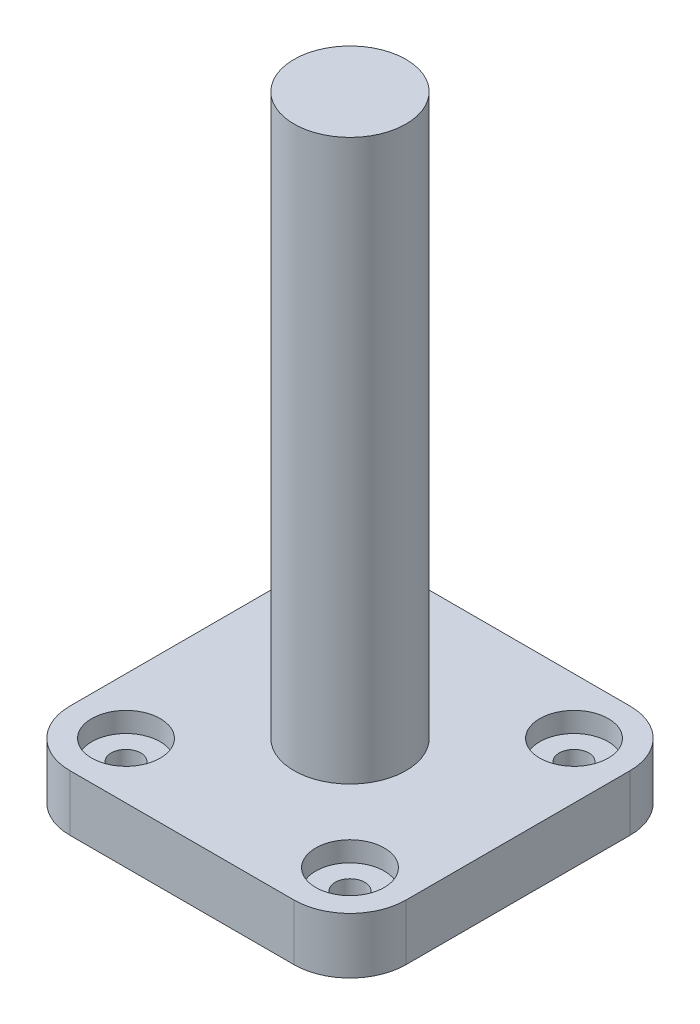
ISO-10303-21;
HEADER;
FILE_DESCRIPTION(('STEP AP214'),'2;1');
FILE_NAME('part.step','',(''),(''),'','','');
FILE_SCHEMA(('AUTOMOTIVE_DESIGN { 1 0 10303 214 1 1 1 1 }'));
ENDSEC;
DATA;
#1=APPLICATION_CONTEXT('core data for automotive mechanical design processes');
#2=APPLICATION_PROTOCOL_DEFINITION('international standard','automotive_design',2000,#1);
#3=PRODUCT_CONTEXT('',#1,'mechanical');
#4=PRODUCT('Part','Part','',(#3));
#5=PRODUCT_RELATED_PRODUCT_CATEGORY('part','',(#4));
#6=PRODUCT_DEFINITION_FORMATION('','',#4);
#7=PRODUCT_DEFINITION_CONTEXT('part definition',#1,'design');
#8=PRODUCT_DEFINITION('design','',#6,#7);
#9=PRODUCT_DEFINITION_SHAPE('','',#8);
#10=(LENGTH_UNIT() NAMED_UNIT(*) SI_UNIT(.MILLI.,.METRE.));
#11=(NAMED_UNIT(*) PLANE_ANGLE_UNIT() SI_UNIT($,.RADIAN.));
#12=(NAMED_UNIT(*) SI_UNIT($,.STERADIAN.) SOLID_ANGLE_UNIT());
#13=UNCERTAINTY_MEASURE_WITH_UNIT(LENGTH_MEASURE(1.E-05),#10,'distance_accuracy_value','');
#14=(GEOMETRIC_REPRESENTATION_CONTEXT(3) GLOBAL_UNCERTAINTY_ASSIGNED_CONTEXT((#13)) GLOBAL_UNIT_ASSIGNED_CONTEXT((#10,
#11,#12)) REPRESENTATION_CONTEXT('',''));
#15=CARTESIAN_POINT('',(0.,0.,0.));
#16=DIRECTION('',(0.,0.,1.));
#17=DIRECTION('',(1.,0.,0.));
#18=AXIS2_PLACEMENT_3D('',#15,#16,#17);
#19=CARTESIAN_POINT('',(-20.,10.,20.));
#20=DIRECTION('',(0.,-1.,0.));
#21=DIRECTION('',(0.,0.,-1.));
#22=AXIS2_PLACEMENT_3D('',#19,#20,#21);
#23=CYLINDRICAL_SURFACE('',#22,10.);
#24=CARTESIAN_POINT('',(-20.,0.,20.));
#25=DIRECTION('',(0.,1.,0.));
#26=DIRECTION('',(0.,0.,-1.));
#27=AXIS2_PLACEMENT_3D('',#24,#25,#26);
#28=CIRCLE('',#27,10.);
#29=CARTESIAN_POINT('',(-30.,0.,19.9999999999999));
#30=VERTEX_POINT('',#29);
#31=CARTESIAN_POINT('',(-19.9999999999999,0.,30.));
#32=VERTEX_POINT('',#31);
#33=EDGE_CURVE('E136',#30,#32,#28,.T.);
#34=ORIENTED_EDGE('',*,*,#33,.T.);
#35=DIRECTION('',(0.,-1.,0.));
#36=VECTOR('',#35,1.);
#37=CARTESIAN_POINT('',(-19.9999999999999,10.,30.));
#38=LINE('',#37,#36);
#39=CARTESIAN_POINT('',(-19.9999999999999,10.,30.));
#40=VERTEX_POINT('',#39);
#41=EDGE_CURVE('E47',#40,#32,#38,.T.);
#42=ORIENTED_EDGE('',*,*,#41,.F.);
#43=CARTESIAN_POINT('',(-20.,10.,20.));
#44=DIRECTION('',(0.,1.,0.));
#45=DIRECTION('',(0.,0.,-1.));
#46=AXIS2_PLACEMENT_3D('',#43,#44,#45);
#47=CIRCLE('',#46,10.);
#48=CARTESIAN_POINT('',(-30.,10.,19.9999999999999));
#49=VERTEX_POINT('',#48);
#50=EDGE_CURVE('E151',#49,#40,#47,.T.);
#51=ORIENTED_EDGE('',*,*,#50,.F.);
#52=DIRECTION('',(0.,-1.,0.));
#53=VECTOR('',#52,1.);
#54=CARTESIAN_POINT('',(-30.,10.,19.9999999999999));
#55=LINE('',#54,#53);
#56=EDGE_CURVE('E132',#49,#30,#55,.T.);
#57=ORIENTED_EDGE('',*,*,#56,.T.);
#58=EDGE_LOOP('',(#34,#42,#51,#57));
#59=FACE_BOUND('',#58,.T.);
#60=ADVANCED_FACE('F39',(#59),#23,.T.);
#61=CARTESIAN_POINT('',(-19.9999999999999,10.,30.));
#62=DIRECTION('',(0.,0.,-1.));
#63=DIRECTION('',(-1.,0.,0.));
#64=AXIS2_PLACEMENT_3D('',#61,#62,#63);
#65=PLANE('',#64);
#66=DIRECTION('',(1.,0.,0.));
#67=VECTOR('',#66,1.);
#68=CARTESIAN_POINT('',(-19.9999999999999,0.,30.));
#69=LINE('',#68,#67);
#70=CARTESIAN_POINT('',(19.9999999999999,0.,30.));
#71=VERTEX_POINT('',#70);
#72=EDGE_CURVE('E139',#32,#71,#69,.T.);
#73=ORIENTED_EDGE('',*,*,#72,.T.);
#74=DIRECTION('',(0.,-1.,0.));
#75=VECTOR('',#74,1.);
#76=CARTESIAN_POINT('',(19.9999999999999,10.,30.));
#77=LINE('',#76,#75);
#78=CARTESIAN_POINT('',(19.9999999999999,10.,30.));
#79=VERTEX_POINT('',#78);
#80=EDGE_CURVE('E161',#79,#71,#77,.T.);
#81=ORIENTED_EDGE('',*,*,#80,.F.);
#82=DIRECTION('',(1.,0.,0.));
#83=VECTOR('',#82,1.);
#84=CARTESIAN_POINT('',(-19.9999999999999,10.,30.));
#85=LINE('',#84,#83);
#86=EDGE_CURVE('E99',#40,#79,#85,.T.);
#87=ORIENTED_EDGE('',*,*,#86,.F.);
#88=ORIENTED_EDGE('',*,*,#41,.T.);
#89=EDGE_LOOP('',(#73,#81,#87,#88));
#90=FACE_BOUND('',#89,.T.);
#91=ADVANCED_FACE('F164',(#90),#65,.F.);
#92=CARTESIAN_POINT('',(20.,10.,20.));
#93=DIRECTION('',(0.,-1.,0.));
#94=DIRECTION('',(0.,0.,-1.));
#95=AXIS2_PLACEMENT_3D('',#92,#93,#94);
#96=CYLINDRICAL_SURFACE('',#95,10.);
#97=CARTESIAN_POINT('',(20.,0.,20.));
#98=DIRECTION('',(0.,1.,0.));
#99=DIRECTION('',(0.,0.,1.));
#100=AXIS2_PLACEMENT_3D('',#97,#98,#99);
#101=CIRCLE('',#100,10.);
#102=CARTESIAN_POINT('',(30.,0.,19.9999999999999));
#103=VERTEX_POINT('',#102);
#104=EDGE_CURVE('E142',#71,#103,#101,.T.);
#105=ORIENTED_EDGE('',*,*,#104,.T.);
#106=DIRECTION('',(0.,-1.,0.));
#107=VECTOR('',#106,1.);
#108=CARTESIAN_POINT('',(30.,10.,19.9999999999999));
#109=LINE('',#108,#107);
#110=CARTESIAN_POINT('',(30.,10.,19.9999999999999));
#111=VERTEX_POINT('',#110);
#112=EDGE_CURVE('E158',#111,#103,#109,.T.);
#113=ORIENTED_EDGE('',*,*,#112,.F.);
#114=CARTESIAN_POINT('',(20.,10.,20.));
#115=DIRECTION('',(0.,1.,0.));
#116=DIRECTION('',(0.,0.,1.));
#117=AXIS2_PLACEMENT_3D('',#114,#115,#116);
#118=CIRCLE('',#117,10.);
#119=EDGE_CURVE('E182',#79,#111,#118,.T.);
#120=ORIENTED_EDGE('',*,*,#119,.F.);
#121=ORIENTED_EDGE('',*,*,#80,.T.);
#122=EDGE_LOOP('',(#105,#113,#120,#121));
#123=FACE_BOUND('',#122,.T.);
#124=ADVANCED_FACE('F175',(#123),#96,.T.);
#125=CARTESIAN_POINT('',(30.,10.,19.9999999999999));
#126=DIRECTION('',(-1.,0.,0.));
#127=DIRECTION('',(0.,0.,1.));
#128=AXIS2_PLACEMENT_3D('',#125,#126,#127);
#129=PLANE('',#128);
#130=DIRECTION('',(0.,0.,-1.));
#131=VECTOR('',#130,1.);
#132=CARTESIAN_POINT('',(30.,0.,19.9999999999999));
#133=LINE('',#132,#131);
#134=CARTESIAN_POINT('',(30.,0.,-19.9999999999999));
#135=VERTEX_POINT('',#134);
#136=EDGE_CURVE('E144',#103,#135,#133,.T.);
#137=ORIENTED_EDGE('',*,*,#136,.T.);
#138=DIRECTION('',(0.,-1.,0.));
#139=VECTOR('',#138,1.);
#140=CARTESIAN_POINT('',(30.,10.,-19.9999999999999));
#141=LINE('',#140,#139);
#142=CARTESIAN_POINT('',(30.,10.,-19.9999999999999));
#143=VERTEX_POINT('',#142);
#144=EDGE_CURVE('E155',#143,#135,#141,.T.);
#145=ORIENTED_EDGE('',*,*,#144,.F.);
#146=DIRECTION('',(0.,0.,-1.));
#147=VECTOR('',#146,1.);
#148=CARTESIAN_POINT('',(30.,10.,19.9999999999999));
#149=LINE('',#148,#147);
#150=EDGE_CURVE('E181',#111,#143,#149,.T.);
#151=ORIENTED_EDGE('',*,*,#150,.F.);
#152=ORIENTED_EDGE('',*,*,#112,.T.);
#153=EDGE_LOOP('',(#137,#145,#151,#152));
#154=FACE_BOUND('',#153,.T.);
#155=ADVANCED_FACE('F179',(#154),#129,.F.);
#156=CARTESIAN_POINT('',(20.,10.,-20.));
#157=DIRECTION('',(0.,-1.,0.));
#158=DIRECTION('',(0.,0.,-1.));
#159=AXIS2_PLACEMENT_3D('',#156,#157,#158);
#160=CYLINDRICAL_SURFACE('',#159,10.);
#161=CARTESIAN_POINT('',(20.,0.,-20.));
#162=DIRECTION('',(0.,1.,0.));
#163=DIRECTION('',(0.,0.,-1.));
#164=AXIS2_PLACEMENT_3D('',#161,#162,#163);
#165=CIRCLE('',#164,10.);
#166=CARTESIAN_POINT('',(19.9999999999999,0.,-30.));
#167=VERTEX_POINT('',#166);
#168=EDGE_CURVE('E146',#135,#167,#165,.T.);
#169=ORIENTED_EDGE('',*,*,#168,.T.);
#170=DIRECTION('',(0.,-1.,0.));
#171=VECTOR('',#170,1.);
#172=CARTESIAN_POINT('',(19.9999999999999,10.,-30.));
#173=LINE('',#172,#171);
#174=CARTESIAN_POINT('',(19.9999999999999,10.,-30.));
#175=VERTEX_POINT('',#174);
#176=EDGE_CURVE('E127',#175,#167,#173,.T.);
#177=ORIENTED_EDGE('',*,*,#176,.F.);
#178=CARTESIAN_POINT('',(20.,10.,-20.));
#179=DIRECTION('',(0.,1.,0.));
#180=DIRECTION('',(0.,0.,-1.));
#181=AXIS2_PLACEMENT_3D('',#178,#179,#180);
#182=CIRCLE('',#181,10.);
#183=EDGE_CURVE('E118',#143,#175,#182,.T.);
#184=ORIENTED_EDGE('',*,*,#183,.F.);
#185=ORIENTED_EDGE('',*,*,#144,.T.);
#186=EDGE_LOOP('',(#169,#177,#184,#185));
#187=FACE_BOUND('',#186,.T.);
#188=ADVANCED_FACE('F288',(#187),#160,.T.);
#189=CARTESIAN_POINT('',(-19.9999999999999,10.,-30.));
#190=DIRECTION('',(0.,0.,1.));
#191=DIRECTION('',(1.,0.,0.));
#192=AXIS2_PLACEMENT_3D('',#189,#190,#191);
#193=PLANE('',#192);
#194=DIRECTION('',(-1.,0.,0.));
#195=VECTOR('',#194,1.);
#196=CARTESIAN_POINT('',(-19.9999999999999,0.,-30.));
#197=LINE('',#196,#195);
#198=CARTESIAN_POINT('',(-19.9999999999999,0.,-30.));
#199=VERTEX_POINT('',#198);
#200=EDGE_CURVE('E126',#167,#199,#197,.T.);
#201=ORIENTED_EDGE('',*,*,#200,.T.);
#202=DIRECTION('',(0.,-1.,0.));
#203=VECTOR('',#202,1.);
#204=CARTESIAN_POINT('',(-19.9999999999999,10.,-30.));
#205=LINE('',#204,#203);
#206=CARTESIAN_POINT('',(-19.9999999999999,10.,-30.));
#207=VERTEX_POINT('',#206);
#208=EDGE_CURVE('E123',#207,#199,#205,.T.);
#209=ORIENTED_EDGE('',*,*,#208,.F.);
#210=DIRECTION('',(-1.,0.,0.));
#211=VECTOR('',#210,1.);
#212=CARTESIAN_POINT('',(-19.9999999999999,10.,-30.));
#213=LINE('',#212,#211);
#214=EDGE_CURVE('E112',#175,#207,#213,.T.);
#215=ORIENTED_EDGE('',*,*,#214,.F.);
#216=ORIENTED_EDGE('',*,*,#176,.T.);
#217=EDGE_LOOP('',(#201,#209,#215,#216));
#218=FACE_BOUND('',#217,.T.);
#219=ADVANCED_FACE('F124',(#218),#193,.F.);
#220=CARTESIAN_POINT('',(-20.,10.,-20.));
#221=DIRECTION('',(0.,-1.,0.));
#222=DIRECTION('',(0.,0.,-1.));
#223=AXIS2_PLACEMENT_3D('',#220,#221,#222);
#224=CYLINDRICAL_SURFACE('',#223,10.);
#225=CARTESIAN_POINT('',(-20.,0.,-20.));
#226=DIRECTION('',(0.,1.,0.));
#227=DIRECTION('',(0.,0.,-1.));
#228=AXIS2_PLACEMENT_3D('',#225,#226,#227);
#229=CIRCLE('',#228,10.);
#230=CARTESIAN_POINT('',(-30.,0.,-19.9999999999999));
#231=VERTEX_POINT('',#230);
#232=EDGE_CURVE('E84',#199,#231,#229,.T.);
#233=ORIENTED_EDGE('',*,*,#232,.T.);
#234=DIRECTION('',(0.,-1.,0.));
#235=VECTOR('',#234,1.);
#236=CARTESIAN_POINT('',(-30.,10.,-19.9999999999999));
#237=LINE('',#236,#235);
#238=CARTESIAN_POINT('',(-30.,10.,-19.9999999999999));
#239=VERTEX_POINT('',#238);
#240=EDGE_CURVE('E128',#239,#231,#237,.T.);
#241=ORIENTED_EDGE('',*,*,#240,.F.);
#242=CARTESIAN_POINT('',(-20.,10.,-20.));
#243=DIRECTION('',(0.,1.,0.));
#244=DIRECTION('',(0.,0.,-1.));
#245=AXIS2_PLACEMENT_3D('',#242,#243,#244);
#246=CIRCLE('',#245,10.);
#247=EDGE_CURVE('E116',#207,#239,#246,.T.);
#248=ORIENTED_EDGE('',*,*,#247,.F.);
#249=ORIENTED_EDGE('',*,*,#208,.T.);
#250=EDGE_LOOP('',(#233,#241,#248,#249));
#251=FACE_BOUND('',#250,.T.);
#252=ADVANCED_FACE('F130',(#251),#224,.T.);
#253=CARTESIAN_POINT('',(-30.,10.,19.9999999999999));
#254=DIRECTION('',(1.,0.,0.));
#255=DIRECTION('',(0.,0.,-1.));
#256=AXIS2_PLACEMENT_3D('',#253,#254,#255);
#257=PLANE('',#256);
#258=DIRECTION('',(0.,0.,1.));
#259=VECTOR('',#258,1.);
#260=CARTESIAN_POINT('',(-30.,0.,19.9999999999999));
#261=LINE('',#260,#259);
#262=EDGE_CURVE('E90',#231,#30,#261,.T.);
#263=ORIENTED_EDGE('',*,*,#262,.T.);
#264=ORIENTED_EDGE('',*,*,#56,.F.);
#265=DIRECTION('',(0.,0.,1.));
#266=VECTOR('',#265,1.);
#267=CARTESIAN_POINT('',(-30.,10.,19.9999999999999));
#268=LINE('',#267,#266);
#269=EDGE_CURVE('E55',#239,#49,#268,.T.);
#270=ORIENTED_EDGE('',*,*,#269,.F.);
#271=ORIENTED_EDGE('',*,*,#240,.T.);
#272=EDGE_LOOP('',(#263,#264,#270,#271));
#273=FACE_BOUND('',#272,.T.);
#274=ADVANCED_FACE('F250',(#273),#257,.F.);
#275=CARTESIAN_POINT('',(-20.,10.,20.));
#276=DIRECTION('',(0.,-1.,0.));
#277=DIRECTION('',(0.,0.,-1.));
#278=AXIS2_PLACEMENT_3D('',#275,#276,#277);
#279=PLANE('',#278);
#280=CARTESIAN_POINT('',(0.,9.99999999999999,0.));
#281=DIRECTION('',(0.,-1.,0.));
#282=DIRECTION('',(0.,0.,-1.));
#283=AXIS2_PLACEMENT_3D('',#280,#281,#282);
#284=CIRCLE('',#283,10.);
#285=CARTESIAN_POINT('',(0.,9.99999999999999,-10.));
#286=VERTEX_POINT('',#285);
#287=EDGE_CURVE('E11',#286,#286,#284,.F.);
#288=ORIENTED_EDGE('',*,*,#287,.F.);
#289=EDGE_LOOP('',(#288));
#290=FACE_BOUND('',#289,.T.);
#291=CARTESIAN_POINT('',(-20.,10.,20.));
#292=DIRECTION('',(0.,1.,0.));
#293=DIRECTION('',(0.,0.,1.));
#294=AXIS2_PLACEMENT_3D('',#291,#292,#293);
#295=CIRCLE('',#294,6.12);
#296=CARTESIAN_POINT('',(-20.,10.,26.12));
#297=VERTEX_POINT('',#296);
#298=EDGE_CURVE('E232',#297,#297,#295,.T.);
#299=ORIENTED_EDGE('',*,*,#298,.F.);
#300=EDGE_LOOP('',(#299));
#301=FACE_BOUND('',#300,.T.);
#302=CARTESIAN_POINT('',(-20.,10.,-20.));
#303=DIRECTION('',(0.,1.,0.));
#304=DIRECTION('',(0.,0.,1.));
#305=AXIS2_PLACEMENT_3D('',#302,#303,#304);
#306=CIRCLE('',#305,6.12);
#307=CARTESIAN_POINT('',(-20.,10.,-13.88));
#308=VERTEX_POINT('',#307);
#309=EDGE_CURVE('E220',#308,#308,#306,.T.);
#310=ORIENTED_EDGE('',*,*,#309,.F.);
#311=EDGE_LOOP('',(#310));
#312=FACE_BOUND('',#311,.T.);
#313=CARTESIAN_POINT('',(20.,10.,-20.));
#314=DIRECTION('',(0.,1.,0.));
#315=DIRECTION('',(0.,0.,1.));
#316=AXIS2_PLACEMENT_3D('',#313,#314,#315);
#317=CIRCLE('',#316,6.12);
#318=CARTESIAN_POINT('',(20.,10.,-13.88));
#319=VERTEX_POINT('',#318);
#320=EDGE_CURVE('E208',#319,#319,#317,.T.);
#321=ORIENTED_EDGE('',*,*,#320,.F.);
#322=EDGE_LOOP('',(#321));
#323=FACE_BOUND('',#322,.T.);
#324=CARTESIAN_POINT('',(20.,10.,20.));
#325=DIRECTION('',(0.,1.,0.));
#326=DIRECTION('',(0.,0.,1.));
#327=AXIS2_PLACEMENT_3D('',#324,#325,#326);
#328=CIRCLE('',#327,6.12);
#329=CARTESIAN_POINT('',(20.,10.,26.12));
#330=VERTEX_POINT('',#329);
#331=EDGE_CURVE('E196',#330,#330,#328,.T.);
#332=ORIENTED_EDGE('',*,*,#331,.F.);
#333=EDGE_LOOP('',(#332));
#334=FACE_BOUND('',#333,.T.);
#335=ORIENTED_EDGE('',*,*,#50,.T.);
#336=ORIENTED_EDGE('',*,*,#86,.T.);
#337=ORIENTED_EDGE('',*,*,#119,.T.);
#338=ORIENTED_EDGE('',*,*,#150,.T.);
#339=ORIENTED_EDGE('',*,*,#183,.T.);
#340=ORIENTED_EDGE('',*,*,#214,.T.);
#341=ORIENTED_EDGE('',*,*,#247,.T.);
#342=ORIENTED_EDGE('',*,*,#269,.T.);
#343=EDGE_LOOP('',(#335,#336,#337,#338,#339,#340,#341,#342));
#344=FACE_BOUND('',#343,.T.);
#345=ADVANCED_FACE('F114',(#290,#301,#312,#323,#334,#344),#279,.F.);
#346=CARTESIAN_POINT('',(-20.,0.,20.));
#347=DIRECTION('',(0.,-1.,0.));
#348=DIRECTION('',(0.,0.,-1.));
#349=AXIS2_PLACEMENT_3D('',#346,#347,#348);
#350=PLANE('',#349);
#351=CARTESIAN_POINT('',(-20.,0.,20.));
#352=DIRECTION('',(0.,1.,0.));
#353=DIRECTION('',(0.,0.,1.));
#354=AXIS2_PLACEMENT_3D('',#351,#352,#353);
#355=CIRCLE('',#354,2.65);
#356=CARTESIAN_POINT('',(-20.,0.,22.65));
#357=VERTEX_POINT('',#356);
#358=EDGE_CURVE('E223',#357,#357,#355,.T.);
#359=ORIENTED_EDGE('',*,*,#358,.T.);
#360=EDGE_LOOP('',(#359));
#361=FACE_BOUND('',#360,.T.);
#362=CARTESIAN_POINT('',(-20.,0.,-20.));
#363=DIRECTION('',(0.,1.,0.));
#364=DIRECTION('',(0.,0.,1.));
#365=AXIS2_PLACEMENT_3D('',#362,#363,#364);
#366=CIRCLE('',#365,2.65);
#367=CARTESIAN_POINT('',(-20.,0.,-17.35));
#368=VERTEX_POINT('',#367);
#369=EDGE_CURVE('E211',#368,#368,#366,.T.);
#370=ORIENTED_EDGE('',*,*,#369,.T.);
#371=EDGE_LOOP('',(#370));
#372=FACE_BOUND('',#371,.T.);
#373=CARTESIAN_POINT('',(20.,0.,-20.));
#374=DIRECTION('',(0.,1.,0.));
#375=DIRECTION('',(0.,0.,1.));
#376=AXIS2_PLACEMENT_3D('',#373,#374,#375);
#377=CIRCLE('',#376,2.65);
#378=CARTESIAN_POINT('',(20.,0.,-17.35));
#379=VERTEX_POINT('',#378);
#380=EDGE_CURVE('E199',#379,#379,#377,.T.);
#381=ORIENTED_EDGE('',*,*,#380,.T.);
#382=EDGE_LOOP('',(#381));
#383=FACE_BOUND('',#382,.T.);
#384=CARTESIAN_POINT('',(20.,0.,20.));
#385=DIRECTION('',(0.,1.,0.));
#386=DIRECTION('',(0.,0.,1.));
#387=AXIS2_PLACEMENT_3D('',#384,#385,#386);
#388=CIRCLE('',#387,2.65);
#389=CARTESIAN_POINT('',(20.,0.,22.65));
#390=VERTEX_POINT('',#389);
#391=EDGE_CURVE('E140',#390,#390,#388,.T.);
#392=ORIENTED_EDGE('',*,*,#391,.T.);
#393=EDGE_LOOP('',(#392));
#394=FACE_BOUND('',#393,.T.);
#395=ORIENTED_EDGE('',*,*,#33,.F.);
#396=ORIENTED_EDGE('',*,*,#262,.F.);
#397=ORIENTED_EDGE('',*,*,#232,.F.);
#398=ORIENTED_EDGE('',*,*,#200,.F.);
#399=ORIENTED_EDGE('',*,*,#168,.F.);
#400=ORIENTED_EDGE('',*,*,#136,.F.);
#401=ORIENTED_EDGE('',*,*,#104,.F.);
#402=ORIENTED_EDGE('',*,*,#72,.F.);
#403=EDGE_LOOP('',(#395,#396,#397,#398,#399,#400,#401,#402));
#404=FACE_BOUND('',#403,.T.);
#405=ADVANCED_FACE('F169',(#361,#372,#383,#394,#404),#350,.T.);
#406=CARTESIAN_POINT('',(20.,10.,20.));
#407=DIRECTION('',(0.,1.,0.));
#408=DIRECTION('',(0.,0.,1.));
#409=AXIS2_PLACEMENT_3D('',#406,#407,#408);
#410=CYLINDRICAL_SURFACE('',#409,2.65);
#411=ORIENTED_EDGE('',*,*,#391,.F.);
#412=EDGE_LOOP('',(#411));
#413=FACE_BOUND('',#412,.T.);
#414=CARTESIAN_POINT('',(20.,6.42,20.));
#415=DIRECTION('',(0.,1.,0.));
#416=DIRECTION('',(0.,0.,1.));
#417=AXIS2_PLACEMENT_3D('',#414,#415,#416);
#418=CIRCLE('',#417,2.65);
#419=CARTESIAN_POINT('',(20.,6.42,22.65));
#420=VERTEX_POINT('',#419);
#421=EDGE_CURVE('E190',#420,#420,#418,.T.);
#422=ORIENTED_EDGE('',*,*,#421,.T.);
#423=EDGE_LOOP('',(#422));
#424=FACE_BOUND('',#423,.T.);
#425=ADVANCED_FACE('F273',(#413,#424),#410,.F.);
#426=CARTESIAN_POINT('',(22.65,6.42,20.));
#427=DIRECTION('',(0.,-1.,0.));
#428=DIRECTION('',(0.,0.,-1.));
#429=AXIS2_PLACEMENT_3D('',#426,#427,#428);
#430=PLANE('',#429);
#431=ORIENTED_EDGE('',*,*,#421,.F.);
#432=EDGE_LOOP('',(#431));
#433=FACE_BOUND('',#432,.T.);
#434=CARTESIAN_POINT('',(20.,6.42,20.));
#435=DIRECTION('',(0.,1.,0.));
#436=DIRECTION('',(0.,0.,1.));
#437=AXIS2_PLACEMENT_3D('',#434,#435,#436);
#438=CIRCLE('',#437,6.12);
#439=CARTESIAN_POINT('',(20.,6.42,26.12));
#440=VERTEX_POINT('',#439);
#441=EDGE_CURVE('E193',#440,#440,#438,.T.);
#442=ORIENTED_EDGE('',*,*,#441,.T.);
#443=EDGE_LOOP('',(#442));
#444=FACE_BOUND('',#443,.T.);
#445=ADVANCED_FACE('F263',(#433,#444),#430,.F.);
#446=CARTESIAN_POINT('',(20.,10.,20.));
#447=DIRECTION('',(0.,1.,0.));
#448=DIRECTION('',(0.,0.,1.));
#449=AXIS2_PLACEMENT_3D('',#446,#447,#448);
#450=CYLINDRICAL_SURFACE('',#449,6.12);
#451=ORIENTED_EDGE('',*,*,#441,.F.);
#452=EDGE_LOOP('',(#451));
#453=FACE_BOUND('',#452,.T.);
#454=ORIENTED_EDGE('',*,*,#331,.T.);
#455=EDGE_LOOP('',(#454));
#456=FACE_BOUND('',#455,.T.);
#457=ADVANCED_FACE('F260',(#453,#456),#450,.F.);
#458=CARTESIAN_POINT('',(20.,10.,-20.));
#459=DIRECTION('',(0.,1.,0.));
#460=DIRECTION('',(0.,0.,1.));
#461=AXIS2_PLACEMENT_3D('',#458,#459,#460);
#462=CYLINDRICAL_SURFACE('',#461,2.65);
#463=ORIENTED_EDGE('',*,*,#380,.F.);
#464=EDGE_LOOP('',(#463));
#465=FACE_BOUND('',#464,.T.);
#466=CARTESIAN_POINT('',(20.,6.42,-20.));
#467=DIRECTION('',(0.,1.,0.));
#468=DIRECTION('',(0.,0.,1.));
#469=AXIS2_PLACEMENT_3D('',#466,#467,#468);
#470=CIRCLE('',#469,2.65);
#471=CARTESIAN_POINT('',(20.,6.42,-17.35));
#472=VERTEX_POINT('',#471);
#473=EDGE_CURVE('E202',#472,#472,#470,.T.);
#474=ORIENTED_EDGE('',*,*,#473,.T.);
#475=EDGE_LOOP('',(#474));
#476=FACE_BOUND('',#475,.T.);
#477=ADVANCED_FACE('F262',(#465,#476),#462,.F.);
#478=CARTESIAN_POINT('',(22.65,6.42,-20.));
#479=DIRECTION('',(0.,-1.,0.));
#480=DIRECTION('',(0.,0.,-1.));
#481=AXIS2_PLACEMENT_3D('',#478,#479,#480);
#482=PLANE('',#481);
#483=ORIENTED_EDGE('',*,*,#473,.F.);
#484=EDGE_LOOP('',(#483));
#485=FACE_BOUND('',#484,.T.);
#486=CARTESIAN_POINT('',(20.,6.42,-20.));
#487=DIRECTION('',(0.,1.,0.));
#488=DIRECTION('',(0.,0.,1.));
#489=AXIS2_PLACEMENT_3D('',#486,#487,#488);
#490=CIRCLE('',#489,6.12);
#491=CARTESIAN_POINT('',(20.,6.42,-13.88));
#492=VERTEX_POINT('',#491);
#493=EDGE_CURVE('E205',#492,#492,#490,.T.);
#494=ORIENTED_EDGE('',*,*,#493,.T.);
#495=EDGE_LOOP('',(#494));
#496=FACE_BOUND('',#495,.T.);
#497=ADVANCED_FACE('F270',(#485,#496),#482,.F.);
#498=CARTESIAN_POINT('',(20.,10.,-20.));
#499=DIRECTION('',(0.,1.,0.));
#500=DIRECTION('',(0.,0.,1.));
#501=AXIS2_PLACEMENT_3D('',#498,#499,#500);
#502=CYLINDRICAL_SURFACE('',#501,6.12);
#503=ORIENTED_EDGE('',*,*,#493,.F.);
#504=EDGE_LOOP('',(#503));
#505=FACE_BOUND('',#504,.T.);
#506=ORIENTED_EDGE('',*,*,#320,.T.);
#507=EDGE_LOOP('',(#506));
#508=FACE_BOUND('',#507,.T.);
#509=ADVANCED_FACE('F337',(#505,#508),#502,.F.);
#510=CARTESIAN_POINT('',(-20.,10.,-20.));
#511=DIRECTION('',(0.,1.,0.));
#512=DIRECTION('',(0.,0.,1.));
#513=AXIS2_PLACEMENT_3D('',#510,#511,#512);
#514=CYLINDRICAL_SURFACE('',#513,2.65);
#515=ORIENTED_EDGE('',*,*,#369,.F.);
#516=EDGE_LOOP('',(#515));
#517=FACE_BOUND('',#516,.T.);
#518=CARTESIAN_POINT('',(-20.,6.42,-20.));
#519=DIRECTION('',(0.,1.,0.));
#520=DIRECTION('',(0.,0.,1.));
#521=AXIS2_PLACEMENT_3D('',#518,#519,#520);
#522=CIRCLE('',#521,2.65);
#523=CARTESIAN_POINT('',(-20.,6.42,-17.35));
#524=VERTEX_POINT('',#523);
#525=EDGE_CURVE('E214',#524,#524,#522,.T.);
#526=ORIENTED_EDGE('',*,*,#525,.T.);
#527=EDGE_LOOP('',(#526));
#528=FACE_BOUND('',#527,.T.);
#529=ADVANCED_FACE('F347',(#517,#528),#514,.F.);
#530=CARTESIAN_POINT('',(-17.35,6.42,-20.));
#531=DIRECTION('',(0.,-1.,0.));
#532=DIRECTION('',(0.,0.,-1.));
#533=AXIS2_PLACEMENT_3D('',#530,#531,#532);
#534=PLANE('',#533);
#535=ORIENTED_EDGE('',*,*,#525,.F.);
#536=EDGE_LOOP('',(#535));
#537=FACE_BOUND('',#536,.T.);
#538=CARTESIAN_POINT('',(-20.,6.42,-20.));
#539=DIRECTION('',(0.,1.,0.));
#540=DIRECTION('',(0.,0.,1.));
#541=AXIS2_PLACEMENT_3D('',#538,#539,#540);
#542=CIRCLE('',#541,6.12);
#543=CARTESIAN_POINT('',(-20.,6.42,-13.88));
#544=VERTEX_POINT('',#543);
#545=EDGE_CURVE('E217',#544,#544,#542,.T.);
#546=ORIENTED_EDGE('',*,*,#545,.T.);
#547=EDGE_LOOP('',(#546));
#548=FACE_BOUND('',#547,.T.);
#549=ADVANCED_FACE('F357',(#537,#548),#534,.F.);
#550=CARTESIAN_POINT('',(-20.,10.,-20.));
#551=DIRECTION('',(0.,1.,0.));
#552=DIRECTION('',(0.,0.,1.));
#553=AXIS2_PLACEMENT_3D('',#550,#551,#552);
#554=CYLINDRICAL_SURFACE('',#553,6.12);
#555=ORIENTED_EDGE('',*,*,#545,.F.);
#556=EDGE_LOOP('',(#555));
#557=FACE_BOUND('',#556,.T.);
#558=ORIENTED_EDGE('',*,*,#309,.T.);
#559=EDGE_LOOP('',(#558));
#560=FACE_BOUND('',#559,.T.);
#561=ADVANCED_FACE('F367',(#557,#560),#554,.F.);
#562=CARTESIAN_POINT('',(-20.,10.,20.));
#563=DIRECTION('',(0.,1.,0.));
#564=DIRECTION('',(0.,0.,1.));
#565=AXIS2_PLACEMENT_3D('',#562,#563,#564);
#566=CYLINDRICAL_SURFACE('',#565,2.65);
#567=ORIENTED_EDGE('',*,*,#358,.F.);
#568=EDGE_LOOP('',(#567));
#569=FACE_BOUND('',#568,.T.);
#570=CARTESIAN_POINT('',(-20.,6.42,20.));
#571=DIRECTION('',(0.,1.,0.));
#572=DIRECTION('',(0.,0.,1.));
#573=AXIS2_PLACEMENT_3D('',#570,#571,#572);
#574=CIRCLE('',#573,2.65);
#575=CARTESIAN_POINT('',(-20.,6.42,22.65));
#576=VERTEX_POINT('',#575);
#577=EDGE_CURVE('E226',#576,#576,#574,.T.);
#578=ORIENTED_EDGE('',*,*,#577,.T.);
#579=EDGE_LOOP('',(#578));
#580=FACE_BOUND('',#579,.T.);
#581=ADVANCED_FACE('F377',(#569,#580),#566,.F.);
#582=CARTESIAN_POINT('',(-17.35,6.42,20.));
#583=DIRECTION('',(0.,-1.,0.));
#584=DIRECTION('',(0.,0.,-1.));
#585=AXIS2_PLACEMENT_3D('',#582,#583,#584);
#586=PLANE('',#585);
#587=ORIENTED_EDGE('',*,*,#577,.F.);
#588=EDGE_LOOP('',(#587));
#589=FACE_BOUND('',#588,.T.);
#590=CARTESIAN_POINT('',(-20.,6.42,20.));
#591=DIRECTION('',(0.,1.,0.));
#592=DIRECTION('',(0.,0.,1.));
#593=AXIS2_PLACEMENT_3D('',#590,#591,#592);
#594=CIRCLE('',#593,6.12);
#595=CARTESIAN_POINT('',(-20.,6.42,26.12));
#596=VERTEX_POINT('',#595);
#597=EDGE_CURVE('E229',#596,#596,#594,.T.);
#598=ORIENTED_EDGE('',*,*,#597,.T.);
#599=EDGE_LOOP('',(#598));
#600=FACE_BOUND('',#599,.T.);
#601=ADVANCED_FACE('F387',(#589,#600),#586,.F.);
#602=CARTESIAN_POINT('',(-20.,10.,20.));
#603=DIRECTION('',(0.,1.,0.));
#604=DIRECTION('',(0.,0.,1.));
#605=AXIS2_PLACEMENT_3D('',#602,#603,#604);
#606=CYLINDRICAL_SURFACE('',#605,6.12);
#607=ORIENTED_EDGE('',*,*,#597,.F.);
#608=EDGE_LOOP('',(#607));
#609=FACE_BOUND('',#608,.T.);
#610=ORIENTED_EDGE('',*,*,#298,.T.);
#611=EDGE_LOOP('',(#610));
#612=FACE_BOUND('',#611,.T.);
#613=ADVANCED_FACE('F244',(#609,#612),#606,.F.);
#614=CARTESIAN_POINT('',(0.,110.,0.));
#615=DIRECTION('',(0.,-1.,0.));
#616=DIRECTION('',(0.,0.,-1.));
#617=AXIS2_PLACEMENT_3D('',#614,#615,#616);
#618=CYLINDRICAL_SURFACE('',#617,10.);
#619=CARTESIAN_POINT('',(0.,110.,0.));
#620=DIRECTION('',(0.,1.,0.));
#621=DIRECTION('',(0.,0.,1.));
#622=AXIS2_PLACEMENT_3D('',#619,#620,#621);
#623=CIRCLE('',#622,10.);
#624=CARTESIAN_POINT('',(0.,110.,-10.));
#625=VERTEX_POINT('',#624);
#626=EDGE_CURVE('E235',#625,#625,#623,.T.);
#627=CARTESIAN_POINT('',(0.,110.,-10.));
#628=CARTESIAN_POINT('',(0.,108.958333333333,-10.));
#629=CARTESIAN_POINT('',(0.,107.916666666667,-10.));
#630=CARTESIAN_POINT('',(0.,105.833333333333,-10.));
#631=CARTESIAN_POINT('',(0.,104.791666666667,-10.));
#632=CARTESIAN_POINT('',(0.,102.708333333333,-10.));
#633=CARTESIAN_POINT('',(0.,101.666666666667,-10.));
#634=CARTESIAN_POINT('',(0.,99.5833333333333,-10.));
#635=CARTESIAN_POINT('',(0.,98.5416666666666,-10.));
#636=CARTESIAN_POINT('',(0.,96.4583333333333,-10.));
#637=CARTESIAN_POINT('',(0.,95.4166666666666,-10.));
#638=CARTESIAN_POINT('',(0.,93.3333333333333,-10.));
#639=CARTESIAN_POINT('',(0.,92.2916666666666,-10.));
#640=CARTESIAN_POINT('',(0.,90.2083333333333,-10.));
#641=CARTESIAN_POINT('',(0.,89.1666666666666,-10.));
#642=CARTESIAN_POINT('',(0.,87.0833333333333,-10.));
#643=CARTESIAN_POINT('',(0.,86.0416666666666,-10.));
#644=CARTESIAN_POINT('',(0.,83.9583333333333,-10.));
#645=CARTESIAN_POINT('',(0.,82.9166666666666,-10.));
#646=CARTESIAN_POINT('',(0.,80.8333333333333,-10.));
#647=CARTESIAN_POINT('',(0.,79.7916666666666,-10.));
#648=CARTESIAN_POINT('',(0.,77.7083333333333,-10.));
#649=CARTESIAN_POINT('',(0.,76.6666666666666,-10.));
#650=CARTESIAN_POINT('',(0.,74.5833333333333,-10.));
#651=CARTESIAN_POINT('',(0.,73.5416666666666,-10.));
#652=CARTESIAN_POINT('',(0.,71.4583333333333,-10.));
#653=CARTESIAN_POINT('',(0.,70.4166666666667,-10.));
#654=CARTESIAN_POINT('',(0.,68.3333333333333,-10.));
#655=CARTESIAN_POINT('',(0.,67.2916666666667,-10.));
#656=CARTESIAN_POINT('',(0.,65.2083333333333,-10.));
#657=CARTESIAN_POINT('',(0.,64.1666666666666,-10.));
#658=CARTESIAN_POINT('',(0.,62.0833333333333,-10.));
#659=CARTESIAN_POINT('',(0.,61.0416666666667,-10.));
#660=CARTESIAN_POINT('',(0.,58.9583333333333,-10.));
#661=CARTESIAN_POINT('',(0.,57.9166666666667,-10.));
#662=CARTESIAN_POINT('',(0.,55.8333333333333,-10.));
#663=CARTESIAN_POINT('',(0.,54.7916666666667,-10.));
#664=CARTESIAN_POINT('',(0.,52.7083333333333,-10.));
#665=CARTESIAN_POINT('',(0.,51.6666666666667,-10.));
#666=CARTESIAN_POINT('',(0.,49.5833333333333,-10.));
#667=CARTESIAN_POINT('',(0.,48.5416666666667,-10.));
#668=CARTESIAN_POINT('',(0.,46.4583333333333,-10.));
#669=CARTESIAN_POINT('',(0.,45.4166666666667,-10.));
#670=CARTESIAN_POINT('',(0.,43.3333333333333,-10.));
#671=CARTESIAN_POINT('',(0.,42.2916666666667,-10.));
#672=CARTESIAN_POINT('',(0.,40.2083333333333,-10.));
#673=CARTESIAN_POINT('',(0.,39.1666666666667,-10.));
#674=CARTESIAN_POINT('',(0.,37.0833333333333,-10.));
#675=CARTESIAN_POINT('',(0.,36.0416666666667,-10.));
#676=CARTESIAN_POINT('',(0.,33.9583333333333,-10.));
#677=CARTESIAN_POINT('',(0.,32.9166666666667,-10.));
#678=CARTESIAN_POINT('',(0.,30.8333333333333,-10.));
#679=CARTESIAN_POINT('',(0.,29.7916666666667,-10.));
#680=CARTESIAN_POINT('',(0.,27.7083333333333,-10.));
#681=CARTESIAN_POINT('',(0.,26.6666666666667,-10.));
#682=CARTESIAN_POINT('',(0.,24.5833333333333,-10.));
#683=CARTESIAN_POINT('',(0.,23.5416666666667,-10.));
#684=CARTESIAN_POINT('',(0.,21.4583333333333,-10.));
#685=CARTESIAN_POINT('',(0.,20.4166666666667,-10.));
#686=CARTESIAN_POINT('',(0.,18.3333333333333,-10.));
#687=CARTESIAN_POINT('',(0.,17.2916666666667,-10.));
#688=CARTESIAN_POINT('',(0.,15.2083333333333,-10.));
#689=CARTESIAN_POINT('',(0.,14.1666666666667,-10.));
#690=CARTESIAN_POINT('',(0.,12.0833333333333,-10.));
#691=CARTESIAN_POINT('',(0.,11.0416666666667,-10.));
#692=CARTESIAN_POINT('',(0.,9.99999999999999,-10.));
#693=B_SPLINE_CURVE_WITH_KNOTS('',3,(#627,#628,#629,#630,#631,#632,#633,#634,#635,#636,#637,
#638,#639,#640,#641,#642,#643,#644,#645,#646,#647,#648,#649,#650,#651,#652,#653,#654,#655,#656,
#657,#658,#659,#660,#661,#662,#663,#664,#665,#666,#667,#668,#669,#670,#671,#672,#673,#674,#675,
#676,#677,#678,#679,#680,#681,#682,#683,#684,#685,#686,#687,#688,#689,#690,#691,#692),
.UNSPECIFIED.,.F.,.F.,(4,2,2,2,2,2,2,2,2,2,2,2,2,2,2,2,2,2,2,2,2,2,2,2,2,2,2,2,2,2,2,2,4),(0.,
3.125,6.25000000000001,9.37500000000001,12.5,15.625,18.75,21.875,25.,28.125,31.25,34.375,37.5,
40.625,43.75,46.875,50.,53.125,56.25,59.375,62.5,65.625,68.75,71.875,75.,78.125,81.25,84.375,
87.5,90.625,93.75,96.875,100.),.UNSPECIFIED.);
#694=EDGE_CURVE('BSEAM241',#625,#286,#693,.T.);
#695=ORIENTED_EDGE('',*,*,#626,.F.);
#696=ORIENTED_EDGE('',*,*,#287,.T.);
#697=ORIENTED_EDGE('',*,*,#694,.T.);
#698=ORIENTED_EDGE('',*,*,#694,.F.);
#699=EDGE_LOOP('',(#695,#697,#696,#698));
#700=FACE_BOUND('',#699,.T.);
#701=ADVANCED_FACE('F241',(#700),#618,.T.);
#702=CARTESIAN_POINT('',(0.,110.,0.));
#703=DIRECTION('',(0.,1.,0.));
#704=DIRECTION('',(0.,0.,1.));
#705=AXIS2_PLACEMENT_3D('',#702,#703,#704);
#706=PLANE('',#705);
#707=ORIENTED_EDGE('',*,*,#626,.T.);
#708=EDGE_LOOP('',(#707));
#709=FACE_BOUND('',#708,.T.);
#710=ADVANCED_FACE('F239',(#709),#706,.T.);
#711=CLOSED_SHELL('',(#60,#91,#124,#155,#188,#219,#252,#274,#345,#405,#425,#445,#457,#477,#497,
#509,#529,#549,#561,#581,#601,#613,#701,#710));
#712=MANIFOLD_SOLID_BREP('B2',#711);
#713=ADVANCED_BREP_SHAPE_REPRESENTATION('',(#18,#712),#14);
#714=SHAPE_DEFINITION_REPRESENTATION(#9,#713);
ENDSEC;
END-ISO-10303-21;
